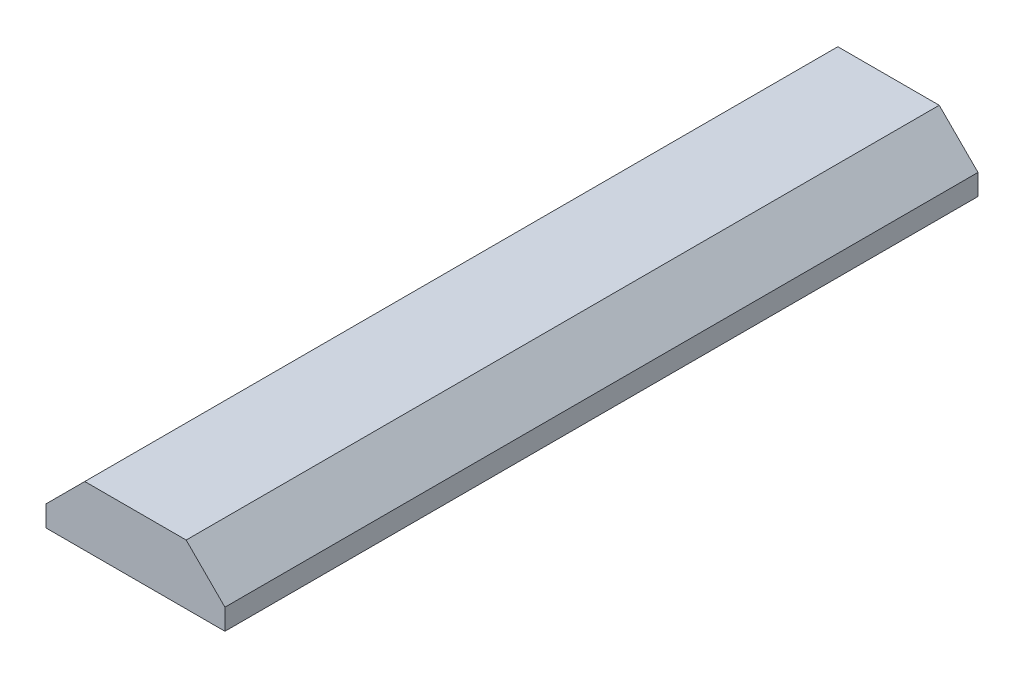
ISO-10303-21;
HEADER;
FILE_DESCRIPTION(('STEP AP214'),'2;1');
FILE_NAME('part.step','',(''),(''),'','','');
FILE_SCHEMA(('AUTOMOTIVE_DESIGN { 1 0 10303 214 1 1 1 1 }'));
ENDSEC;
DATA;
#1=APPLICATION_CONTEXT('core data for automotive mechanical design processes');
#2=APPLICATION_PROTOCOL_DEFINITION('international standard','automotive_design',2000,#1);
#3=PRODUCT_CONTEXT('',#1,'mechanical');
#4=PRODUCT('Part','Part','',(#3));
#5=PRODUCT_RELATED_PRODUCT_CATEGORY('part','',(#4));
#6=PRODUCT_DEFINITION_FORMATION('','',#4);
#7=PRODUCT_DEFINITION_CONTEXT('part definition',#1,'design');
#8=PRODUCT_DEFINITION('design','',#6,#7);
#9=PRODUCT_DEFINITION_SHAPE('','',#8);
#10=(LENGTH_UNIT() NAMED_UNIT(*) SI_UNIT(.MILLI.,.METRE.));
#11=(NAMED_UNIT(*) PLANE_ANGLE_UNIT() SI_UNIT($,.RADIAN.));
#12=(NAMED_UNIT(*) SI_UNIT($,.STERADIAN.) SOLID_ANGLE_UNIT());
#13=UNCERTAINTY_MEASURE_WITH_UNIT(LENGTH_MEASURE(1.E-05),#10,'distance_accuracy_value','');
#14=(GEOMETRIC_REPRESENTATION_CONTEXT(3) GLOBAL_UNCERTAINTY_ASSIGNED_CONTEXT((#13)) GLOBAL_UNIT_ASSIGNED_CONTEXT((#10,
#11,#12)) REPRESENTATION_CONTEXT('',''));
#15=CARTESIAN_POINT('',(0.,0.,0.));
#16=DIRECTION('',(0.,0.,1.));
#17=DIRECTION('',(1.,0.,0.));
#18=AXIS2_PLACEMENT_3D('',#15,#16,#17);
#19=CARTESIAN_POINT('',(3.4,1.80885878693797,50.5));
#20=DIRECTION('',(0.707106781186549,0.707106781186546,0.));
#21=DIRECTION('',(-0.707106781186546,0.707106781186549,0.));
#22=AXIS2_PLACEMENT_3D('',#19,#20,#21);
#23=PLANE('',#22);
#24=DIRECTION('',(0.707106781186546,-0.707106781186549,0.));
#25=VECTOR('',#24,1.);
#26=CARTESIAN_POINT('',(3.4,1.80885878693797,0.));
#27=LINE('',#26,#25);
#28=CARTESIAN_POINT('',(3.4,1.80885878693797,0.));
#29=VERTEX_POINT('',#28);
#30=CARTESIAN_POINT('',(6.,-0.791141213062042,0.));
#31=VERTEX_POINT('',#30);
#32=EDGE_CURVE('E127',#29,#31,#27,.T.);
#33=ORIENTED_EDGE('',*,*,#32,.F.);
#34=DIRECTION('',(0.,0.,-1.));
#35=VECTOR('',#34,1.);
#36=CARTESIAN_POINT('',(3.4,1.80885878693797,50.5));
#37=LINE('',#36,#35);
#38=CARTESIAN_POINT('',(3.4,1.80885878693797,50.5));
#39=VERTEX_POINT('',#38);
#40=EDGE_CURVE('E11',#39,#29,#37,.T.);
#41=ORIENTED_EDGE('',*,*,#40,.F.);
#42=DIRECTION('',(0.707106781186546,-0.707106781186549,0.));
#43=VECTOR('',#42,1.);
#44=CARTESIAN_POINT('',(3.4,1.80885878693797,50.5));
#45=LINE('',#44,#43);
#46=CARTESIAN_POINT('',(6.,-0.791141213062042,50.5));
#47=VERTEX_POINT('',#46);
#48=EDGE_CURVE('E139',#39,#47,#45,.T.);
#49=ORIENTED_EDGE('',*,*,#48,.T.);
#50=DIRECTION('',(0.,0.,-1.));
#51=VECTOR('',#50,1.);
#52=CARTESIAN_POINT('',(6.,-0.791141213062042,50.5));
#53=LINE('',#52,#51);
#54=EDGE_CURVE('E44',#47,#31,#53,.T.);
#55=ORIENTED_EDGE('',*,*,#54,.T.);
#56=EDGE_LOOP('',(#33,#41,#49,#55));
#57=FACE_BOUND('',#56,.T.);
#58=ADVANCED_FACE('F41',(#57),#23,.T.);
#59=CARTESIAN_POINT('',(3.4,1.80885878693797,50.5));
#60=DIRECTION('',(0.,-1.,0.));
#61=DIRECTION('',(0.,0.,-1.));
#62=AXIS2_PLACEMENT_3D('',#59,#60,#61);
#63=PLANE('',#62);
#64=DIRECTION('',(-1.,0.,0.));
#65=VECTOR('',#64,1.);
#66=CARTESIAN_POINT('',(3.4,1.80885878693797,0.));
#67=LINE('',#66,#65);
#68=CARTESIAN_POINT('',(-3.4,1.80885878693797,0.));
#69=VERTEX_POINT('',#68);
#70=EDGE_CURVE('E80',#29,#69,#67,.T.);
#71=ORIENTED_EDGE('',*,*,#70,.T.);
#72=DIRECTION('',(0.,0.,-1.));
#73=VECTOR('',#72,1.);
#74=CARTESIAN_POINT('',(-3.4,1.80885878693797,50.5));
#75=LINE('',#74,#73);
#76=CARTESIAN_POINT('',(-3.4,1.80885878693797,50.5));
#77=VERTEX_POINT('',#76);
#78=EDGE_CURVE('E50',#77,#69,#75,.T.);
#79=ORIENTED_EDGE('',*,*,#78,.F.);
#80=DIRECTION('',(-1.,0.,0.));
#81=VECTOR('',#80,1.);
#82=CARTESIAN_POINT('',(3.4,1.80885878693797,50.5));
#83=LINE('',#82,#81);
#84=EDGE_CURVE('E105',#39,#77,#83,.T.);
#85=ORIENTED_EDGE('',*,*,#84,.F.);
#86=ORIENTED_EDGE('',*,*,#40,.T.);
#87=EDGE_LOOP('',(#71,#79,#85,#86));
#88=FACE_BOUND('',#87,.T.);
#89=ADVANCED_FACE('F159',(#88),#63,.F.);
#90=CARTESIAN_POINT('',(-3.4,1.80885878693797,50.5));
#91=DIRECTION('',(0.707106781186549,-0.707106781186546,0.));
#92=DIRECTION('',(0.707106781186546,0.707106781186549,0.));
#93=AXIS2_PLACEMENT_3D('',#90,#91,#92);
#94=PLANE('',#93);
#95=DIRECTION('',(-0.707106781186546,-0.707106781186549,0.));
#96=VECTOR('',#95,1.);
#97=CARTESIAN_POINT('',(-3.4,1.80885878693797,0.));
#98=LINE('',#97,#96);
#99=CARTESIAN_POINT('',(-6.,-0.791141213062042,0.));
#100=VERTEX_POINT('',#99);
#101=EDGE_CURVE('E112',#69,#100,#98,.T.);
#102=ORIENTED_EDGE('',*,*,#101,.T.);
#103=DIRECTION('',(0.,0.,-1.));
#104=VECTOR('',#103,1.);
#105=CARTESIAN_POINT('',(-6.,-0.791141213062042,50.5));
#106=LINE('',#105,#104);
#107=CARTESIAN_POINT('',(-6.,-0.791141213062042,50.5));
#108=VERTEX_POINT('',#107);
#109=EDGE_CURVE('E109',#108,#100,#106,.T.);
#110=ORIENTED_EDGE('',*,*,#109,.F.);
#111=DIRECTION('',(-0.707106781186546,-0.707106781186549,0.));
#112=VECTOR('',#111,1.);
#113=CARTESIAN_POINT('',(-3.4,1.80885878693797,50.5));
#114=LINE('',#113,#112);
#115=EDGE_CURVE('E98',#77,#108,#114,.T.);
#116=ORIENTED_EDGE('',*,*,#115,.F.);
#117=ORIENTED_EDGE('',*,*,#78,.T.);
#118=EDGE_LOOP('',(#102,#110,#116,#117));
#119=FACE_BOUND('',#118,.T.);
#120=ADVANCED_FACE('F110',(#119),#94,.F.);
#121=CARTESIAN_POINT('',(-6.,-0.791141213062042,50.5));
#122=DIRECTION('',(1.,0.,0.));
#123=DIRECTION('',(0.,0.,-1.));
#124=AXIS2_PLACEMENT_3D('',#121,#122,#123);
#125=PLANE('',#124);
#126=DIRECTION('',(0.,-1.,0.));
#127=VECTOR('',#126,1.);
#128=CARTESIAN_POINT('',(-6.,-0.791141213062042,0.));
#129=LINE('',#128,#127);
#130=CARTESIAN_POINT('',(-6.,-2.19114121306203,0.));
#131=VERTEX_POINT('',#130);
#132=EDGE_CURVE('E136',#100,#131,#129,.T.);
#133=ORIENTED_EDGE('',*,*,#132,.T.);
#134=DIRECTION('',(0.,0.,-1.));
#135=VECTOR('',#134,1.);
#136=CARTESIAN_POINT('',(-6.,-2.19114121306203,50.5));
#137=LINE('',#136,#135);
#138=CARTESIAN_POINT('',(-6.,-2.19114121306203,50.5));
#139=VERTEX_POINT('',#138);
#140=EDGE_CURVE('E115',#139,#131,#137,.T.);
#141=ORIENTED_EDGE('',*,*,#140,.F.);
#142=DIRECTION('',(0.,-1.,0.));
#143=VECTOR('',#142,1.);
#144=CARTESIAN_POINT('',(-6.,-0.791141213062042,50.5));
#145=LINE('',#144,#143);
#146=EDGE_CURVE('E103',#108,#139,#145,.T.);
#147=ORIENTED_EDGE('',*,*,#146,.F.);
#148=ORIENTED_EDGE('',*,*,#109,.T.);
#149=EDGE_LOOP('',(#133,#141,#147,#148));
#150=FACE_BOUND('',#149,.T.);
#151=ADVANCED_FACE('F117',(#150),#125,.F.);
#152=CARTESIAN_POINT('',(-6.,-2.19114121306203,50.5));
#153=DIRECTION('',(0.,1.,0.));
#154=DIRECTION('',(0.,0.,1.));
#155=AXIS2_PLACEMENT_3D('',#152,#153,#154);
#156=PLANE('',#155);
#157=DIRECTION('',(1.,0.,0.));
#158=VECTOR('',#157,1.);
#159=CARTESIAN_POINT('',(-6.,-2.19114121306203,0.));
#160=LINE('',#159,#158);
#161=CARTESIAN_POINT('',(6.,-2.19114121306203,0.));
#162=VERTEX_POINT('',#161);
#163=EDGE_CURVE('E133',#131,#162,#160,.T.);
#164=ORIENTED_EDGE('',*,*,#163,.T.);
#165=DIRECTION('',(0.,0.,-1.));
#166=VECTOR('',#165,1.);
#167=CARTESIAN_POINT('',(6.,-2.19114121306203,50.5));
#168=LINE('',#167,#166);
#169=CARTESIAN_POINT('',(6.,-2.19114121306203,50.5));
#170=VERTEX_POINT('',#169);
#171=EDGE_CURVE('E142',#170,#162,#168,.T.);
#172=ORIENTED_EDGE('',*,*,#171,.F.);
#173=DIRECTION('',(1.,0.,0.));
#174=VECTOR('',#173,1.);
#175=CARTESIAN_POINT('',(-6.,-2.19114121306203,50.5));
#176=LINE('',#175,#174);
#177=EDGE_CURVE('E120',#139,#170,#176,.T.);
#178=ORIENTED_EDGE('',*,*,#177,.F.);
#179=ORIENTED_EDGE('',*,*,#140,.T.);
#180=EDGE_LOOP('',(#164,#172,#178,#179));
#181=FACE_BOUND('',#180,.T.);
#182=ADVANCED_FACE('F149',(#181),#156,.F.);
#183=CARTESIAN_POINT('',(6.,-0.791141213062042,50.5));
#184=DIRECTION('',(1.,0.,0.));
#185=DIRECTION('',(0.,0.,-1.));
#186=AXIS2_PLACEMENT_3D('',#183,#184,#185);
#187=PLANE('',#186);
#188=DIRECTION('',(0.,-1.,0.));
#189=VECTOR('',#188,1.);
#190=CARTESIAN_POINT('',(6.,-0.791141213062042,0.));
#191=LINE('',#190,#189);
#192=EDGE_CURVE('E130',#31,#162,#191,.T.);
#193=ORIENTED_EDGE('',*,*,#192,.F.);
#194=ORIENTED_EDGE('',*,*,#54,.F.);
#195=DIRECTION('',(0.,-1.,0.));
#196=VECTOR('',#195,1.);
#197=CARTESIAN_POINT('',(6.,-0.791141213062042,50.5));
#198=LINE('',#197,#196);
#199=EDGE_CURVE('E122',#47,#170,#198,.T.);
#200=ORIENTED_EDGE('',*,*,#199,.T.);
#201=ORIENTED_EDGE('',*,*,#171,.T.);
#202=EDGE_LOOP('',(#193,#194,#200,#201));
#203=FACE_BOUND('',#202,.T.);
#204=ADVANCED_FACE('F144',(#203),#187,.T.);
#205=CARTESIAN_POINT('',(0.,0.,50.5));
#206=DIRECTION('',(0.,0.,-1.));
#207=DIRECTION('',(-1.,0.,0.));
#208=AXIS2_PLACEMENT_3D('',#205,#206,#207);
#209=PLANE('',#208);
#210=ORIENTED_EDGE('',*,*,#48,.F.);
#211=ORIENTED_EDGE('',*,*,#84,.T.);
#212=ORIENTED_EDGE('',*,*,#115,.T.);
#213=ORIENTED_EDGE('',*,*,#146,.T.);
#214=ORIENTED_EDGE('',*,*,#177,.T.);
#215=ORIENTED_EDGE('',*,*,#199,.F.);
#216=EDGE_LOOP('',(#210,#211,#212,#213,#214,#215));
#217=FACE_BOUND('',#216,.T.);
#218=ADVANCED_FACE('F101',(#217),#209,.F.);
#219=CARTESIAN_POINT('',(0.,0.,0.));
#220=DIRECTION('',(0.,0.,-1.));
#221=DIRECTION('',(-1.,0.,0.));
#222=AXIS2_PLACEMENT_3D('',#219,#220,#221);
#223=PLANE('',#222);
#224=ORIENTED_EDGE('',*,*,#32,.T.);
#225=ORIENTED_EDGE('',*,*,#192,.T.);
#226=ORIENTED_EDGE('',*,*,#163,.F.);
#227=ORIENTED_EDGE('',*,*,#132,.F.);
#228=ORIENTED_EDGE('',*,*,#101,.F.);
#229=ORIENTED_EDGE('',*,*,#70,.F.);
#230=EDGE_LOOP('',(#224,#225,#226,#227,#228,#229));
#231=FACE_BOUND('',#230,.T.);
#232=ADVANCED_FACE('F147',(#231),#223,.T.);
#233=CLOSED_SHELL('',(#58,#89,#120,#151,#182,#204,#218,#232));
#234=MANIFOLD_SOLID_BREP('B2',#233);
#235=ADVANCED_BREP_SHAPE_REPRESENTATION('',(#18,#234),#14);
#236=SHAPE_DEFINITION_REPRESENTATION(#9,#235);
ENDSEC;
END-ISO-10303-21;
